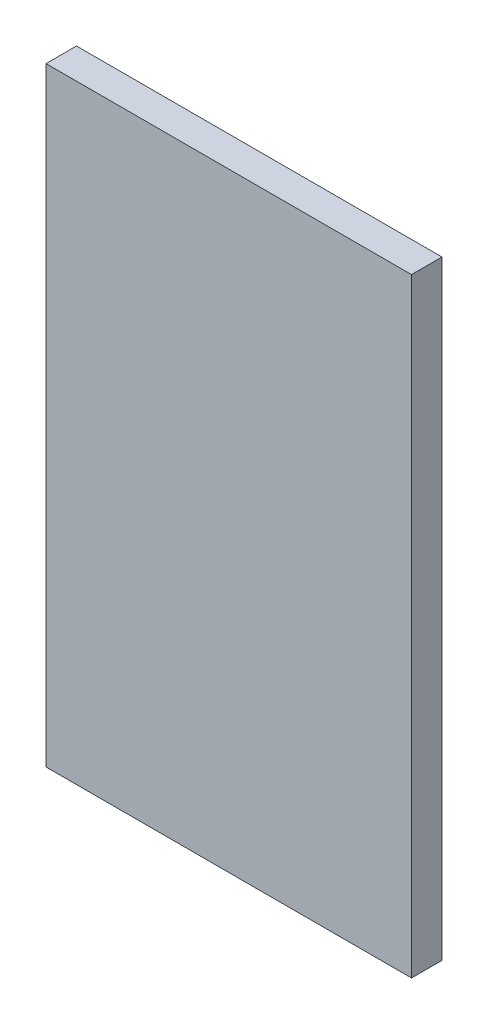
ISO-10303-21;
HEADER;
FILE_DESCRIPTION(('STEP AP214'),'2;1');
FILE_NAME('part.step','',(''),(''),'','','');
FILE_SCHEMA(('AUTOMOTIVE_DESIGN { 1 0 10303 214 1 1 1 1 }'));
ENDSEC;
DATA;
#1=APPLICATION_CONTEXT('core data for automotive mechanical design processes');
#2=APPLICATION_PROTOCOL_DEFINITION('international standard','automotive_design',2000,#1);
#3=PRODUCT_CONTEXT('',#1,'mechanical');
#4=PRODUCT('Part','Part','',(#3));
#5=PRODUCT_RELATED_PRODUCT_CATEGORY('part','',(#4));
#6=PRODUCT_DEFINITION_FORMATION('','',#4);
#7=PRODUCT_DEFINITION_CONTEXT('part definition',#1,'design');
#8=PRODUCT_DEFINITION('design','',#6,#7);
#9=PRODUCT_DEFINITION_SHAPE('','',#8);
#10=(LENGTH_UNIT() NAMED_UNIT(*) SI_UNIT(.MILLI.,.METRE.));
#11=(NAMED_UNIT(*) PLANE_ANGLE_UNIT() SI_UNIT($,.RADIAN.));
#12=(NAMED_UNIT(*) SI_UNIT($,.STERADIAN.) SOLID_ANGLE_UNIT());
#13=UNCERTAINTY_MEASURE_WITH_UNIT(LENGTH_MEASURE(1.E-05),#10,'distance_accuracy_value','');
#14=(GEOMETRIC_REPRESENTATION_CONTEXT(3) GLOBAL_UNCERTAINTY_ASSIGNED_CONTEXT((#13)) GLOBAL_UNIT_ASSIGNED_CONTEXT((#10,
#11,#12)) REPRESENTATION_CONTEXT('',''));
#15=CARTESIAN_POINT('',(0.,0.,0.));
#16=DIRECTION('',(0.,0.,1.));
#17=DIRECTION('',(1.,0.,0.));
#18=AXIS2_PLACEMENT_3D('',#15,#16,#17);
#19=CARTESIAN_POINT('',(-81.1023622047243,118.897637795276,10.));
#20=DIRECTION('',(1.,0.,0.));
#21=DIRECTION('',(0.,0.,-1.));
#22=AXIS2_PLACEMENT_3D('',#19,#20,#21);
#23=PLANE('',#22);
#24=DIRECTION('',(0.,-1.,0.));
#25=VECTOR('',#24,1.);
#26=CARTESIAN_POINT('',(-81.1023622047243,118.897637795276,0.));
#27=LINE('',#26,#25);
#28=CARTESIAN_POINT('',(-81.1023622047243,118.897637795276,0.));
#29=VERTEX_POINT('',#28);
#30=CARTESIAN_POINT('',(-81.1023622047243,-81.1023622047244,0.));
#31=VERTEX_POINT('',#30);
#32=EDGE_CURVE('E113',#29,#31,#27,.T.);
#33=ORIENTED_EDGE('',*,*,#32,.T.);
#34=DIRECTION('',(0.,0.,-1.));
#35=VECTOR('',#34,1.);
#36=CARTESIAN_POINT('',(-81.1023622047243,-81.1023622047244,10.));
#37=LINE('',#36,#35);
#38=CARTESIAN_POINT('',(-81.1023622047243,-81.1023622047244,10.));
#39=VERTEX_POINT('',#38);
#40=EDGE_CURVE('E11',#39,#31,#37,.T.);
#41=ORIENTED_EDGE('',*,*,#40,.F.);
#42=DIRECTION('',(0.,-1.,0.));
#43=VECTOR('',#42,1.);
#44=CARTESIAN_POINT('',(-81.1023622047243,118.897637795276,10.));
#45=LINE('',#44,#43);
#46=CARTESIAN_POINT('',(-81.1023622047243,118.897637795276,10.));
#47=VERTEX_POINT('',#46);
#48=EDGE_CURVE('E97',#47,#39,#45,.T.);
#49=ORIENTED_EDGE('',*,*,#48,.F.);
#50=DIRECTION('',(0.,0.,-1.));
#51=VECTOR('',#50,1.);
#52=CARTESIAN_POINT('',(-81.1023622047243,118.897637795276,10.));
#53=LINE('',#52,#51);
#54=EDGE_CURVE('E109',#47,#29,#53,.T.);
#55=ORIENTED_EDGE('',*,*,#54,.T.);
#56=EDGE_LOOP('',(#33,#41,#49,#55));
#57=FACE_BOUND('',#56,.T.);
#58=ADVANCED_FACE('F45',(#57),#23,.F.);
#59=CARTESIAN_POINT('',(-81.1023622047243,-81.1023622047244,10.));
#60=DIRECTION('',(0.,1.,0.));
#61=DIRECTION('',(-1.,0.,0.));
#62=AXIS2_PLACEMENT_3D('',#59,#60,#61);
#63=PLANE('',#62);
#64=DIRECTION('',(1.,0.,0.));
#65=VECTOR('',#64,1.);
#66=CARTESIAN_POINT('',(-81.1023622047243,-81.1023622047244,0.));
#67=LINE('',#66,#65);
#68=CARTESIAN_POINT('',(38.8976377952758,-81.1023622047244,0.));
#69=VERTEX_POINT('',#68);
#70=EDGE_CURVE('E102',#31,#69,#67,.T.);
#71=ORIENTED_EDGE('',*,*,#70,.T.);
#72=DIRECTION('',(0.,0.,-1.));
#73=VECTOR('',#72,1.);
#74=CARTESIAN_POINT('',(38.8976377952758,-81.1023622047244,10.));
#75=LINE('',#74,#73);
#76=CARTESIAN_POINT('',(38.8976377952758,-81.1023622047244,10.));
#77=VERTEX_POINT('',#76);
#78=EDGE_CURVE('E54',#77,#69,#75,.T.);
#79=ORIENTED_EDGE('',*,*,#78,.F.);
#80=DIRECTION('',(1.,0.,0.));
#81=VECTOR('',#80,1.);
#82=CARTESIAN_POINT('',(-81.1023622047243,-81.1023622047244,10.));
#83=LINE('',#82,#81);
#84=EDGE_CURVE('E92',#39,#77,#83,.T.);
#85=ORIENTED_EDGE('',*,*,#84,.F.);
#86=ORIENTED_EDGE('',*,*,#40,.T.);
#87=EDGE_LOOP('',(#71,#79,#85,#86));
#88=FACE_BOUND('',#87,.T.);
#89=ADVANCED_FACE('F101',(#88),#63,.F.);
#90=CARTESIAN_POINT('',(38.8976377952757,118.897637795276,10.));
#91=DIRECTION('',(-1.,0.,0.));
#92=DIRECTION('',(0.,-1.,0.));
#93=AXIS2_PLACEMENT_3D('',#90,#91,#92);
#94=PLANE('',#93);
#95=DIRECTION('',(0.,1.,0.));
#96=VECTOR('',#95,1.);
#97=CARTESIAN_POINT('',(38.8976377952757,118.897637795276,0.));
#98=LINE('',#97,#96);
#99=CARTESIAN_POINT('',(38.8976377952757,118.897637795276,0.));
#100=VERTEX_POINT('',#99);
#101=EDGE_CURVE('E79',#69,#100,#98,.T.);
#102=ORIENTED_EDGE('',*,*,#101,.T.);
#103=DIRECTION('',(0.,0.,-1.));
#104=VECTOR('',#103,1.);
#105=CARTESIAN_POINT('',(38.8976377952757,118.897637795276,10.));
#106=LINE('',#105,#104);
#107=CARTESIAN_POINT('',(38.8976377952757,118.897637795276,10.));
#108=VERTEX_POINT('',#107);
#109=EDGE_CURVE('E104',#108,#100,#106,.T.);
#110=ORIENTED_EDGE('',*,*,#109,.F.);
#111=DIRECTION('',(0.,1.,0.));
#112=VECTOR('',#111,1.);
#113=CARTESIAN_POINT('',(38.8976377952757,118.897637795276,10.));
#114=LINE('',#113,#112);
#115=EDGE_CURVE('E95',#77,#108,#114,.T.);
#116=ORIENTED_EDGE('',*,*,#115,.F.);
#117=ORIENTED_EDGE('',*,*,#78,.T.);
#118=EDGE_LOOP('',(#102,#110,#116,#117));
#119=FACE_BOUND('',#118,.T.);
#120=ADVANCED_FACE('F105',(#119),#94,.F.);
#121=CARTESIAN_POINT('',(-81.1023622047243,118.897637795276,10.));
#122=DIRECTION('',(0.,-1.,0.));
#123=DIRECTION('',(0.,0.,-1.));
#124=AXIS2_PLACEMENT_3D('',#121,#122,#123);
#125=PLANE('',#124);
#126=DIRECTION('',(-1.,0.,0.));
#127=VECTOR('',#126,1.);
#128=CARTESIAN_POINT('',(-81.1023622047243,118.897637795276,0.));
#129=LINE('',#128,#127);
#130=EDGE_CURVE('E85',#100,#29,#129,.T.);
#131=ORIENTED_EDGE('',*,*,#130,.T.);
#132=ORIENTED_EDGE('',*,*,#54,.F.);
#133=DIRECTION('',(-1.,0.,0.));
#134=VECTOR('',#133,1.);
#135=CARTESIAN_POINT('',(-81.1023622047243,118.897637795276,10.));
#136=LINE('',#135,#134);
#137=EDGE_CURVE('E62',#108,#47,#136,.T.);
#138=ORIENTED_EDGE('',*,*,#137,.F.);
#139=ORIENTED_EDGE('',*,*,#109,.T.);
#140=EDGE_LOOP('',(#131,#132,#138,#139));
#141=FACE_BOUND('',#140,.T.);
#142=ADVANCED_FACE('F126',(#141),#125,.F.);
#143=CARTESIAN_POINT('',(0.,0.,10.));
#144=DIRECTION('',(0.,0.,1.));
#145=DIRECTION('',(1.,0.,0.));
#146=AXIS2_PLACEMENT_3D('',#143,#144,#145);
#147=PLANE('',#146);
#148=ORIENTED_EDGE('',*,*,#48,.T.);
#149=ORIENTED_EDGE('',*,*,#84,.T.);
#150=ORIENTED_EDGE('',*,*,#115,.T.);
#151=ORIENTED_EDGE('',*,*,#137,.T.);
#152=EDGE_LOOP('',(#148,#149,#150,#151));
#153=FACE_BOUND('',#152,.T.);
#154=ADVANCED_FACE('F93',(#153),#147,.T.);
#155=CARTESIAN_POINT('',(0.,0.,0.));
#156=DIRECTION('',(0.,0.,1.));
#157=DIRECTION('',(1.,0.,0.));
#158=AXIS2_PLACEMENT_3D('',#155,#156,#157);
#159=PLANE('',#158);
#160=ORIENTED_EDGE('',*,*,#32,.F.);
#161=ORIENTED_EDGE('',*,*,#130,.F.);
#162=ORIENTED_EDGE('',*,*,#101,.F.);
#163=ORIENTED_EDGE('',*,*,#70,.F.);
#164=EDGE_LOOP('',(#160,#161,#162,#163));
#165=FACE_BOUND('',#164,.T.);
#166=ADVANCED_FACE('F129',(#165),#159,.F.);
#167=CLOSED_SHELL('',(#58,#89,#120,#142,#154,#166));
#168=MANIFOLD_SOLID_BREP('B2',#167);
#169=ADVANCED_BREP_SHAPE_REPRESENTATION('',(#18,#168),#14);
#170=SHAPE_DEFINITION_REPRESENTATION(#9,#169);
ENDSEC;
END-ISO-10303-21;
